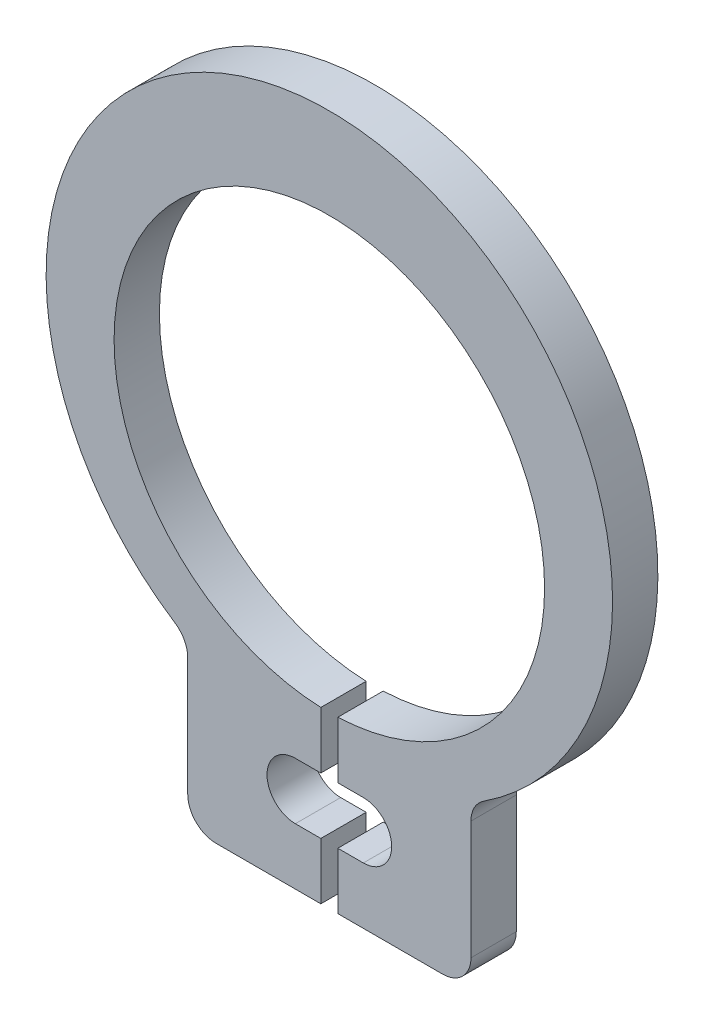
ISO-10303-21;
HEADER;
FILE_DESCRIPTION(('STEP AP214'),'2;1');
FILE_NAME('part.step','',(''),(''),'','','');
FILE_SCHEMA(('AUTOMOTIVE_DESIGN { 1 0 10303 214 1 1 1 1 }'));
ENDSEC;
DATA;
#1=APPLICATION_CONTEXT('core data for automotive mechanical design processes');
#2=APPLICATION_PROTOCOL_DEFINITION('international standard','automotive_design',2000,#1);
#3=PRODUCT_CONTEXT('',#1,'mechanical');
#4=PRODUCT('Part','Part','',(#3));
#5=PRODUCT_RELATED_PRODUCT_CATEGORY('part','',(#4));
#6=PRODUCT_DEFINITION_FORMATION('','',#4);
#7=PRODUCT_DEFINITION_CONTEXT('part definition',#1,'design');
#8=PRODUCT_DEFINITION('design','',#6,#7);
#9=PRODUCT_DEFINITION_SHAPE('','',#8);
#10=(LENGTH_UNIT() NAMED_UNIT(*) SI_UNIT(.MILLI.,.METRE.));
#11=(NAMED_UNIT(*) PLANE_ANGLE_UNIT() SI_UNIT($,.RADIAN.));
#12=(NAMED_UNIT(*) SI_UNIT($,.STERADIAN.) SOLID_ANGLE_UNIT());
#13=UNCERTAINTY_MEASURE_WITH_UNIT(LENGTH_MEASURE(1.E-05),#10,'distance_accuracy_value','');
#14=(GEOMETRIC_REPRESENTATION_CONTEXT(3) GLOBAL_UNCERTAINTY_ASSIGNED_CONTEXT((#13)) GLOBAL_UNIT_ASSIGNED_CONTEXT((#10,
#11,#12)) REPRESENTATION_CONTEXT('',''));
#15=CARTESIAN_POINT('',(0.,0.,0.));
#16=DIRECTION('',(0.,0.,1.));
#17=DIRECTION('',(1.,0.,0.));
#18=AXIS2_PLACEMENT_3D('',#15,#16,#17);
#19=CARTESIAN_POINT('',(-0.15,-6.8,0.8));
#20=DIRECTION('',(-1.,0.,0.));
#21=DIRECTION('',(0.,-1.,0.));
#22=AXIS2_PLACEMENT_3D('',#19,#20,#21);
#23=PLANE('',#22);
#24=DIRECTION('',(0.,1.,0.));
#25=VECTOR('',#24,1.);
#26=CARTESIAN_POINT('',(-0.15,-6.8,0.8));
#27=LINE('',#26,#25);
#28=CARTESIAN_POINT('',(-0.15,-4.8,0.8));
#29=VERTEX_POINT('',#28);
#30=CARTESIAN_POINT('',(-0.15,-3.79703831953274,0.8));
#31=VERTEX_POINT('',#30);
#32=EDGE_CURVE('E239',#29,#31,#27,.T.);
#33=ORIENTED_EDGE('',*,*,#32,.F.);
#34=DIRECTION('',(0.,0.,-1.));
#35=VECTOR('',#34,1.);
#36=CARTESIAN_POINT('',(-0.15,-4.8,0.8));
#37=LINE('',#36,#35);
#38=CARTESIAN_POINT('',(-0.15,-4.8,0.));
#39=VERTEX_POINT('',#38);
#40=EDGE_CURVE('E221',#29,#39,#37,.T.);
#41=ORIENTED_EDGE('',*,*,#40,.T.);
#42=DIRECTION('',(0.,1.,0.));
#43=VECTOR('',#42,1.);
#44=CARTESIAN_POINT('',(-0.15,-6.8,0.));
#45=LINE('',#44,#43);
#46=CARTESIAN_POINT('',(-0.15,-3.79703831953274,0.));
#47=VERTEX_POINT('',#46);
#48=EDGE_CURVE('E267',#39,#47,#45,.T.);
#49=ORIENTED_EDGE('',*,*,#48,.T.);
#50=DIRECTION('',(0.,0.,-1.));
#51=VECTOR('',#50,1.);
#52=CARTESIAN_POINT('',(-0.15,-3.79703831953274,0.8));
#53=LINE('',#52,#51);
#54=EDGE_CURVE('E296',#31,#47,#53,.T.);
#55=ORIENTED_EDGE('',*,*,#54,.F.);
#56=EDGE_LOOP('',(#33,#41,#49,#55));
#57=FACE_BOUND('',#56,.T.);
#58=ADVANCED_FACE('F36',(#57),#23,.F.);
#59=CARTESIAN_POINT('',(0.15,-3.79703831953274,0.8));
#60=DIRECTION('',(1.,0.,0.));
#61=DIRECTION('',(0.,1.,0.));
#62=AXIS2_PLACEMENT_3D('',#59,#60,#61);
#63=PLANE('',#62);
#64=DIRECTION('',(0.,-1.,0.));
#65=VECTOR('',#64,1.);
#66=CARTESIAN_POINT('',(0.15,-3.79703831953274,0.));
#67=LINE('',#66,#65);
#68=CARTESIAN_POINT('',(0.150000000000005,-3.79703831953274,0.));
#69=VERTEX_POINT('',#68);
#70=CARTESIAN_POINT('',(0.150000000000003,-4.8,0.));
#71=VERTEX_POINT('',#70);
#72=EDGE_CURVE('E274',#69,#71,#67,.T.);
#73=ORIENTED_EDGE('',*,*,#72,.T.);
#74=DIRECTION('',(0.,0.,1.));
#75=VECTOR('',#74,1.);
#76=CARTESIAN_POINT('',(0.15,-4.8,0.8));
#77=LINE('',#76,#75);
#78=CARTESIAN_POINT('',(0.150000000000003,-4.8,0.8));
#79=VERTEX_POINT('',#78);
#80=EDGE_CURVE('E218',#71,#79,#77,.T.);
#81=ORIENTED_EDGE('',*,*,#80,.T.);
#82=DIRECTION('',(0.,-1.,0.));
#83=VECTOR('',#82,1.);
#84=CARTESIAN_POINT('',(0.15,-3.79703831953274,0.8));
#85=LINE('',#84,#83);
#86=CARTESIAN_POINT('',(0.150000000000005,-3.79703831953274,0.8));
#87=VERTEX_POINT('',#86);
#88=EDGE_CURVE('E246',#87,#79,#85,.T.);
#89=ORIENTED_EDGE('',*,*,#88,.F.);
#90=DIRECTION('',(0.,0.,-1.));
#91=VECTOR('',#90,1.);
#92=CARTESIAN_POINT('',(0.150000000000005,-3.79703831953274,0.8));
#93=LINE('',#92,#91);
#94=EDGE_CURVE('E293',#87,#69,#93,.T.);
#95=ORIENTED_EDGE('',*,*,#94,.T.);
#96=EDGE_LOOP('',(#73,#81,#89,#95));
#97=FACE_BOUND('',#96,.T.);
#98=ADVANCED_FACE('F388',(#97),#63,.F.);
#99=CARTESIAN_POINT('',(3.,-4.20977222864644,0.8));
#100=DIRECTION('',(0.,0.,-1.));
#101=DIRECTION('',(-1.,0.,0.));
#102=AXIS2_PLACEMENT_3D('',#99,#100,#101);
#103=CYLINDRICAL_SURFACE('',#102,0.499999999999999);
#104=CARTESIAN_POINT('',(3.,-4.20977222864644,0.));
#105=DIRECTION('',(0.,0.,-1.));
#106=DIRECTION('',(-1.,0.,0.));
#107=AXIS2_PLACEMENT_3D('',#104,#105,#106);
#108=CIRCLE('',#107,0.499999999999999);
#109=CARTESIAN_POINT('',(2.5,-4.20977222864644,0.));
#110=VERTEX_POINT('',#109);
#111=CARTESIAN_POINT('',(2.72727272727273,-3.79070202604222,0.));
#112=VERTEX_POINT('',#111);
#113=EDGE_CURVE('E224',#110,#112,#108,.T.);
#114=ORIENTED_EDGE('',*,*,#113,.T.);
#115=DIRECTION('',(0.,0.,-1.));
#116=VECTOR('',#115,1.);
#117=CARTESIAN_POINT('',(2.72727272727273,-3.79070202604222,0.8));
#118=LINE('',#117,#116);
#119=CARTESIAN_POINT('',(2.72727272727273,-3.79070202604222,0.8));
#120=VERTEX_POINT('',#119);
#121=EDGE_CURVE('E314',#120,#112,#118,.T.);
#122=ORIENTED_EDGE('',*,*,#121,.F.);
#123=CARTESIAN_POINT('',(3.,-4.20977222864644,0.8));
#124=DIRECTION('',(0.,0.,-1.));
#125=DIRECTION('',(-1.,0.,0.));
#126=AXIS2_PLACEMENT_3D('',#123,#124,#125);
#127=CIRCLE('',#126,0.499999999999999);
#128=CARTESIAN_POINT('',(2.5,-4.20977222864644,0.8));
#129=VERTEX_POINT('',#128);
#130=EDGE_CURVE('E225',#129,#120,#127,.T.);
#131=ORIENTED_EDGE('',*,*,#130,.F.);
#132=DIRECTION('',(0.,0.,-1.));
#133=VECTOR('',#132,1.);
#134=CARTESIAN_POINT('',(2.5,-4.20977222864644,0.8));
#135=LINE('',#134,#133);
#136=EDGE_CURVE('E254',#129,#110,#135,.T.);
#137=ORIENTED_EDGE('',*,*,#136,.T.);
#138=EDGE_LOOP('',(#114,#122,#131,#137));
#139=FACE_BOUND('',#138,.T.);
#140=ADVANCED_FACE('F38',(#139),#103,.F.);
#141=CARTESIAN_POINT('',(0.,0.4,0.8));
#142=DIRECTION('',(0.,0.,-1.));
#143=DIRECTION('',(-1.,0.,0.));
#144=AXIS2_PLACEMENT_3D('',#141,#142,#143);
#145=CYLINDRICAL_SURFACE('',#144,5.);
#146=CARTESIAN_POINT('',(0.,0.4,0.));
#147=DIRECTION('',(0.,0.,1.));
#148=DIRECTION('',(1.,0.,0.));
#149=AXIS2_PLACEMENT_3D('',#146,#147,#148);
#150=CIRCLE('',#149,5.);
#151=CARTESIAN_POINT('',(-2.72727272727273,-3.79070202604222,0.));
#152=VERTEX_POINT('',#151);
#153=EDGE_CURVE('E257',#112,#152,#150,.T.);
#154=ORIENTED_EDGE('',*,*,#153,.T.);
#155=DIRECTION('',(0.,0.,-1.));
#156=VECTOR('',#155,1.);
#157=CARTESIAN_POINT('',(-2.72727272727273,-3.79070202604222,0.8));
#158=LINE('',#157,#156);
#159=CARTESIAN_POINT('',(-2.72727272727273,-3.79070202604222,0.8));
#160=VERTEX_POINT('',#159);
#161=EDGE_CURVE('E311',#160,#152,#158,.T.);
#162=ORIENTED_EDGE('',*,*,#161,.F.);
#163=CARTESIAN_POINT('',(0.,0.4,0.8));
#164=DIRECTION('',(0.,0.,1.));
#165=DIRECTION('',(1.,0.,0.));
#166=AXIS2_PLACEMENT_3D('',#163,#164,#165);
#167=CIRCLE('',#166,5.);
#168=EDGE_CURVE('E228',#120,#160,#167,.T.);
#169=ORIENTED_EDGE('',*,*,#168,.F.);
#170=ORIENTED_EDGE('',*,*,#121,.T.);
#171=EDGE_LOOP('',(#154,#162,#169,#170));
#172=FACE_BOUND('',#171,.T.);
#173=ADVANCED_FACE('F362',(#172),#145,.T.);
#174=CARTESIAN_POINT('',(-3.,-4.20977222864644,0.8));
#175=DIRECTION('',(0.,0.,-1.));
#176=DIRECTION('',(-1.,0.,0.));
#177=AXIS2_PLACEMENT_3D('',#174,#175,#176);
#178=CYLINDRICAL_SURFACE('',#177,0.5);
#179=CARTESIAN_POINT('',(-3.,-4.20977222864644,0.));
#180=DIRECTION('',(0.,0.,-1.));
#181=DIRECTION('',(-1.,0.,0.));
#182=AXIS2_PLACEMENT_3D('',#179,#180,#181);
#183=CIRCLE('',#182,0.5);
#184=CARTESIAN_POINT('',(-2.5,-4.20977222864644,0.));
#185=VERTEX_POINT('',#184);
#186=EDGE_CURVE('E259',#152,#185,#183,.T.);
#187=ORIENTED_EDGE('',*,*,#186,.T.);
#188=DIRECTION('',(0.,0.,-1.));
#189=VECTOR('',#188,1.);
#190=CARTESIAN_POINT('',(-2.5,-4.20977222864644,0.8));
#191=LINE('',#190,#189);
#192=CARTESIAN_POINT('',(-2.5,-4.20977222864644,0.8));
#193=VERTEX_POINT('',#192);
#194=EDGE_CURVE('E308',#193,#185,#191,.T.);
#195=ORIENTED_EDGE('',*,*,#194,.F.);
#196=CARTESIAN_POINT('',(-3.,-4.20977222864644,0.8));
#197=DIRECTION('',(0.,0.,-1.));
#198=DIRECTION('',(-1.,0.,0.));
#199=AXIS2_PLACEMENT_3D('',#196,#197,#198);
#200=CIRCLE('',#199,0.5);
#201=EDGE_CURVE('E231',#160,#193,#200,.T.);
#202=ORIENTED_EDGE('',*,*,#201,.F.);
#203=ORIENTED_EDGE('',*,*,#161,.T.);
#204=EDGE_LOOP('',(#187,#195,#202,#203));
#205=FACE_BOUND('',#204,.T.);
#206=ADVANCED_FACE('F358',(#205),#178,.F.);
#207=CARTESIAN_POINT('',(-2.5,-4.20977222864644,0.8));
#208=DIRECTION('',(1.,0.,0.));
#209=DIRECTION('',(0.,1.,0.));
#210=AXIS2_PLACEMENT_3D('',#207,#208,#209);
#211=PLANE('',#210);
#212=DIRECTION('',(0.,-1.,0.));
#213=VECTOR('',#212,1.);
#214=CARTESIAN_POINT('',(-2.5,-4.20977222864644,0.));
#215=LINE('',#214,#213);
#216=CARTESIAN_POINT('',(-2.5,-6.3,0.));
#217=VERTEX_POINT('',#216);
#218=EDGE_CURVE('E261',#185,#217,#215,.T.);
#219=ORIENTED_EDGE('',*,*,#218,.T.);
#220=DIRECTION('',(0.,0.,-1.));
#221=VECTOR('',#220,1.);
#222=CARTESIAN_POINT('',(-2.5,-6.3,0.8));
#223=LINE('',#222,#221);
#224=CARTESIAN_POINT('',(-2.5,-6.3,0.8));
#225=VERTEX_POINT('',#224);
#226=EDGE_CURVE('E305',#225,#217,#223,.T.);
#227=ORIENTED_EDGE('',*,*,#226,.F.);
#228=DIRECTION('',(0.,-1.,0.));
#229=VECTOR('',#228,1.);
#230=CARTESIAN_POINT('',(-2.5,-4.20977222864644,0.8));
#231=LINE('',#230,#229);
#232=EDGE_CURVE('E233',#193,#225,#231,.T.);
#233=ORIENTED_EDGE('',*,*,#232,.F.);
#234=ORIENTED_EDGE('',*,*,#194,.T.);
#235=EDGE_LOOP('',(#219,#227,#233,#234));
#236=FACE_BOUND('',#235,.T.);
#237=ADVANCED_FACE('F353',(#236),#211,.F.);
#238=CARTESIAN_POINT('',(-2.,-6.3,0.8));
#239=DIRECTION('',(0.,0.,-1.));
#240=DIRECTION('',(-1.,0.,0.));
#241=AXIS2_PLACEMENT_3D('',#238,#239,#240);
#242=CYLINDRICAL_SURFACE('',#241,0.5);
#243=CARTESIAN_POINT('',(-2.,-6.3,0.));
#244=DIRECTION('',(0.,0.,1.));
#245=DIRECTION('',(1.,0.,0.));
#246=AXIS2_PLACEMENT_3D('',#243,#244,#245);
#247=CIRCLE('',#246,0.5);
#248=CARTESIAN_POINT('',(-2.,-6.8,0.));
#249=VERTEX_POINT('',#248);
#250=EDGE_CURVE('E263',#217,#249,#247,.T.);
#251=ORIENTED_EDGE('',*,*,#250,.T.);
#252=DIRECTION('',(0.,0.,-1.));
#253=VECTOR('',#252,1.);
#254=CARTESIAN_POINT('',(-2.,-6.8,0.8));
#255=LINE('',#254,#253);
#256=CARTESIAN_POINT('',(-2.,-6.8,0.8));
#257=VERTEX_POINT('',#256);
#258=EDGE_CURVE('E302',#257,#249,#255,.T.);
#259=ORIENTED_EDGE('',*,*,#258,.F.);
#260=CARTESIAN_POINT('',(-2.,-6.3,0.8));
#261=DIRECTION('',(0.,0.,1.));
#262=DIRECTION('',(1.,0.,0.));
#263=AXIS2_PLACEMENT_3D('',#260,#261,#262);
#264=CIRCLE('',#263,0.5);
#265=EDGE_CURVE('E235',#225,#257,#264,.T.);
#266=ORIENTED_EDGE('',*,*,#265,.F.);
#267=ORIENTED_EDGE('',*,*,#226,.T.);
#268=EDGE_LOOP('',(#251,#259,#266,#267));
#269=FACE_BOUND('',#268,.T.);
#270=ADVANCED_FACE('F349',(#269),#242,.T.);
#271=CARTESIAN_POINT('',(-2.,-6.8,0.8));
#272=DIRECTION('',(0.,1.,0.));
#273=DIRECTION('',(0.,0.,1.));
#274=AXIS2_PLACEMENT_3D('',#271,#272,#273);
#275=PLANE('',#274);
#276=DIRECTION('',(1.,0.,0.));
#277=VECTOR('',#276,1.);
#278=CARTESIAN_POINT('',(-2.,-6.8,0.));
#279=LINE('',#278,#277);
#280=CARTESIAN_POINT('',(-0.15,-6.8,0.));
#281=VERTEX_POINT('',#280);
#282=EDGE_CURVE('E265',#249,#281,#279,.T.);
#283=ORIENTED_EDGE('',*,*,#282,.T.);
#284=DIRECTION('',(0.,0.,-1.));
#285=VECTOR('',#284,1.);
#286=CARTESIAN_POINT('',(-0.15,-6.8,0.8));
#287=LINE('',#286,#285);
#288=CARTESIAN_POINT('',(-0.15,-6.8,0.8));
#289=VERTEX_POINT('',#288);
#290=EDGE_CURVE('E299',#289,#281,#287,.T.);
#291=ORIENTED_EDGE('',*,*,#290,.F.);
#292=DIRECTION('',(1.,0.,0.));
#293=VECTOR('',#292,1.);
#294=CARTESIAN_POINT('',(-2.,-6.8,0.8));
#295=LINE('',#294,#293);
#296=EDGE_CURVE('E237',#257,#289,#295,.T.);
#297=ORIENTED_EDGE('',*,*,#296,.F.);
#298=ORIENTED_EDGE('',*,*,#258,.T.);
#299=EDGE_LOOP('',(#283,#291,#297,#298));
#300=FACE_BOUND('',#299,.T.);
#301=ADVANCED_FACE('F344',(#300),#275,.F.);
#302=CARTESIAN_POINT('',(-0.15,-5.8,0.));
#303=VERTEX_POINT('',#302);
#304=EDGE_CURVE('E268',#281,#303,#45,.T.);
#305=ORIENTED_EDGE('',*,*,#304,.T.);
#306=DIRECTION('',(0.,0.,1.));
#307=VECTOR('',#306,1.);
#308=CARTESIAN_POINT('',(-0.15,-5.8,0.8));
#309=LINE('',#308,#307);
#310=CARTESIAN_POINT('',(-0.15,-5.8,0.8));
#311=VERTEX_POINT('',#310);
#312=EDGE_CURVE('E59',#303,#311,#309,.T.);
#313=ORIENTED_EDGE('',*,*,#312,.T.);
#314=EDGE_CURVE('E240',#289,#311,#27,.T.);
#315=ORIENTED_EDGE('',*,*,#314,.F.);
#316=ORIENTED_EDGE('',*,*,#290,.T.);
#317=EDGE_LOOP('',(#305,#313,#315,#316));
#318=FACE_BOUND('',#317,.T.);
#319=ADVANCED_FACE('F338',(#318),#23,.F.);
#320=CARTESIAN_POINT('',(0.,0.,0.8));
#321=DIRECTION('',(0.,0.,-1.));
#322=DIRECTION('',(-1.,0.,0.));
#323=AXIS2_PLACEMENT_3D('',#320,#321,#322);
#324=CYLINDRICAL_SURFACE('',#323,3.80000000000002);
#325=CARTESIAN_POINT('',(0.,0.,0.));
#326=DIRECTION('',(0.,0.,-1.));
#327=DIRECTION('',(-1.,0.,0.));
#328=AXIS2_PLACEMENT_3D('',#325,#326,#327);
#329=CIRCLE('',#328,3.80000000000002);
#330=EDGE_CURVE('E271',#47,#69,#329,.T.);
#331=ORIENTED_EDGE('',*,*,#330,.T.);
#332=ORIENTED_EDGE('',*,*,#94,.F.);
#333=CARTESIAN_POINT('',(0.,0.,0.8));
#334=DIRECTION('',(0.,0.,-1.));
#335=DIRECTION('',(-1.,0.,0.));
#336=AXIS2_PLACEMENT_3D('',#333,#334,#335);
#337=CIRCLE('',#336,3.80000000000002);
#338=EDGE_CURVE('E243',#31,#87,#337,.T.);
#339=ORIENTED_EDGE('',*,*,#338,.F.);
#340=ORIENTED_EDGE('',*,*,#54,.T.);
#341=EDGE_LOOP('',(#331,#332,#339,#340));
#342=FACE_BOUND('',#341,.T.);
#343=ADVANCED_FACE('F386',(#342),#324,.F.);
#344=CARTESIAN_POINT('',(0.150000000000003,-5.8,0.8));
#345=VERTEX_POINT('',#344);
#346=CARTESIAN_POINT('',(0.15,-6.8,0.8));
#347=VERTEX_POINT('',#346);
#348=EDGE_CURVE('E245',#345,#347,#85,.T.);
#349=ORIENTED_EDGE('',*,*,#348,.F.);
#350=DIRECTION('',(0.,0.,-1.));
#351=VECTOR('',#350,1.);
#352=CARTESIAN_POINT('',(0.15,-5.8,0.8));
#353=LINE('',#352,#351);
#354=CARTESIAN_POINT('',(0.150000000000003,-5.8,0.));
#355=VERTEX_POINT('',#354);
#356=EDGE_CURVE('E186',#345,#355,#353,.T.);
#357=ORIENTED_EDGE('',*,*,#356,.T.);
#358=CARTESIAN_POINT('',(0.15,-6.8,0.));
#359=VERTEX_POINT('',#358);
#360=EDGE_CURVE('E273',#355,#359,#67,.T.);
#361=ORIENTED_EDGE('',*,*,#360,.T.);
#362=DIRECTION('',(0.,0.,-1.));
#363=VECTOR('',#362,1.);
#364=CARTESIAN_POINT('',(0.15,-6.8,0.8));
#365=LINE('',#364,#363);
#366=EDGE_CURVE('E290',#347,#359,#365,.T.);
#367=ORIENTED_EDGE('',*,*,#366,.F.);
#368=EDGE_LOOP('',(#349,#357,#361,#367));
#369=FACE_BOUND('',#368,.T.);
#370=ADVANCED_FACE('F384',(#369),#63,.F.);
#371=CARTESIAN_POINT('',(0.15,-6.8,0.8));
#372=DIRECTION('',(0.,1.,0.));
#373=DIRECTION('',(0.,0.,1.));
#374=AXIS2_PLACEMENT_3D('',#371,#372,#373);
#375=PLANE('',#374);
#376=DIRECTION('',(1.,0.,0.));
#377=VECTOR('',#376,1.);
#378=CARTESIAN_POINT('',(0.15,-6.8,0.));
#379=LINE('',#378,#377);
#380=CARTESIAN_POINT('',(2.,-6.8,0.));
#381=VERTEX_POINT('',#380);
#382=EDGE_CURVE('E277',#359,#381,#379,.T.);
#383=ORIENTED_EDGE('',*,*,#382,.T.);
#384=DIRECTION('',(0.,0.,-1.));
#385=VECTOR('',#384,1.);
#386=CARTESIAN_POINT('',(2.,-6.8,0.8));
#387=LINE('',#386,#385);
#388=CARTESIAN_POINT('',(2.,-6.8,0.8));
#389=VERTEX_POINT('',#388);
#390=EDGE_CURVE('E287',#389,#381,#387,.T.);
#391=ORIENTED_EDGE('',*,*,#390,.F.);
#392=DIRECTION('',(1.,0.,0.));
#393=VECTOR('',#392,1.);
#394=CARTESIAN_POINT('',(0.15,-6.8,0.8));
#395=LINE('',#394,#393);
#396=EDGE_CURVE('E248',#347,#389,#395,.T.);
#397=ORIENTED_EDGE('',*,*,#396,.F.);
#398=ORIENTED_EDGE('',*,*,#366,.T.);
#399=EDGE_LOOP('',(#383,#391,#397,#398));
#400=FACE_BOUND('',#399,.T.);
#401=ADVANCED_FACE('F380',(#400),#375,.F.);
#402=CARTESIAN_POINT('',(2.,-6.3,0.8));
#403=DIRECTION('',(0.,0.,-1.));
#404=DIRECTION('',(-1.,0.,0.));
#405=AXIS2_PLACEMENT_3D('',#402,#403,#404);
#406=CYLINDRICAL_SURFACE('',#405,0.5);
#407=CARTESIAN_POINT('',(2.,-6.3,0.));
#408=DIRECTION('',(0.,0.,1.));
#409=DIRECTION('',(1.,0.,0.));
#410=AXIS2_PLACEMENT_3D('',#407,#408,#409);
#411=CIRCLE('',#410,0.5);
#412=CARTESIAN_POINT('',(2.5,-6.3,0.));
#413=VERTEX_POINT('',#412);
#414=EDGE_CURVE('E279',#381,#413,#411,.T.);
#415=ORIENTED_EDGE('',*,*,#414,.T.);
#416=DIRECTION('',(0.,0.,-1.));
#417=VECTOR('',#416,1.);
#418=CARTESIAN_POINT('',(2.5,-6.3,0.8));
#419=LINE('',#418,#417);
#420=CARTESIAN_POINT('',(2.5,-6.3,0.8));
#421=VERTEX_POINT('',#420);
#422=EDGE_CURVE('E284',#421,#413,#419,.T.);
#423=ORIENTED_EDGE('',*,*,#422,.F.);
#424=CARTESIAN_POINT('',(2.,-6.3,0.8));
#425=DIRECTION('',(0.,0.,1.));
#426=DIRECTION('',(1.,0.,0.));
#427=AXIS2_PLACEMENT_3D('',#424,#425,#426);
#428=CIRCLE('',#427,0.5);
#429=EDGE_CURVE('E250',#389,#421,#428,.T.);
#430=ORIENTED_EDGE('',*,*,#429,.F.);
#431=ORIENTED_EDGE('',*,*,#390,.T.);
#432=EDGE_LOOP('',(#415,#423,#430,#431));
#433=FACE_BOUND('',#432,.T.);
#434=ADVANCED_FACE('F376',(#433),#406,.T.);
#435=CARTESIAN_POINT('',(2.5,-6.3,0.8));
#436=DIRECTION('',(-1.,0.,0.));
#437=DIRECTION('',(0.,-1.,0.));
#438=AXIS2_PLACEMENT_3D('',#435,#436,#437);
#439=PLANE('',#438);
#440=DIRECTION('',(0.,1.,0.));
#441=VECTOR('',#440,1.);
#442=CARTESIAN_POINT('',(2.5,-6.3,0.));
#443=LINE('',#442,#441);
#444=EDGE_CURVE('E229',#413,#110,#443,.T.);
#445=ORIENTED_EDGE('',*,*,#444,.T.);
#446=ORIENTED_EDGE('',*,*,#136,.F.);
#447=DIRECTION('',(0.,1.,0.));
#448=VECTOR('',#447,1.);
#449=CARTESIAN_POINT('',(2.5,-6.3,0.8));
#450=LINE('',#449,#448);
#451=EDGE_CURVE('E252',#421,#129,#450,.T.);
#452=ORIENTED_EDGE('',*,*,#451,.F.);
#453=ORIENTED_EDGE('',*,*,#422,.T.);
#454=EDGE_LOOP('',(#445,#446,#452,#453));
#455=FACE_BOUND('',#454,.T.);
#456=ADVANCED_FACE('F371',(#455),#439,.F.);
#457=CARTESIAN_POINT('',(3.,-4.20977222864644,0.8));
#458=DIRECTION('',(0.,0.,-1.));
#459=DIRECTION('',(-1.,0.,0.));
#460=AXIS2_PLACEMENT_3D('',#457,#458,#459);
#461=PLANE('',#460);
#462=ORIENTED_EDGE('',*,*,#88,.T.);
#463=DIRECTION('',(1.,0.,0.));
#464=VECTOR('',#463,1.);
#465=CARTESIAN_POINT('',(0.599999999999999,-4.8,0.8));
#466=LINE('',#465,#464);
#467=CARTESIAN_POINT('',(0.599999999999999,-4.8,0.8));
#468=VERTEX_POINT('',#467);
#469=EDGE_CURVE('E194',#79,#468,#466,.T.);
#470=ORIENTED_EDGE('',*,*,#469,.T.);
#471=CARTESIAN_POINT('',(0.599999999999999,-5.3,0.8));
#472=DIRECTION('',(0.,0.,-1.));
#473=DIRECTION('',(-1.,0.,0.));
#474=AXIS2_PLACEMENT_3D('',#471,#472,#473);
#475=CIRCLE('',#474,0.5);
#476=CARTESIAN_POINT('',(0.599999999999999,-5.8,0.8));
#477=VERTEX_POINT('',#476);
#478=EDGE_CURVE('E175',#468,#477,#475,.T.);
#479=ORIENTED_EDGE('',*,*,#478,.T.);
#480=DIRECTION('',(-1.,0.,0.));
#481=VECTOR('',#480,1.);
#482=CARTESIAN_POINT('',(-0.600000000000001,-5.8,0.8));
#483=LINE('',#482,#481);
#484=EDGE_CURVE('E183',#477,#345,#483,.T.);
#485=ORIENTED_EDGE('',*,*,#484,.T.);
#486=ORIENTED_EDGE('',*,*,#348,.T.);
#487=ORIENTED_EDGE('',*,*,#396,.T.);
#488=ORIENTED_EDGE('',*,*,#429,.T.);
#489=ORIENTED_EDGE('',*,*,#451,.T.);
#490=ORIENTED_EDGE('',*,*,#130,.T.);
#491=ORIENTED_EDGE('',*,*,#168,.T.);
#492=ORIENTED_EDGE('',*,*,#201,.T.);
#493=ORIENTED_EDGE('',*,*,#232,.T.);
#494=ORIENTED_EDGE('',*,*,#265,.T.);
#495=ORIENTED_EDGE('',*,*,#296,.T.);
#496=ORIENTED_EDGE('',*,*,#314,.T.);
#497=CARTESIAN_POINT('',(-0.600000000000001,-5.8,0.8));
#498=VERTEX_POINT('',#497);
#499=EDGE_CURVE('E190',#311,#498,#483,.T.);
#500=ORIENTED_EDGE('',*,*,#499,.T.);
#501=CARTESIAN_POINT('',(-0.600000000000001,-5.3,0.8));
#502=DIRECTION('',(0.,0.,-1.));
#503=DIRECTION('',(-1.,0.,0.));
#504=AXIS2_PLACEMENT_3D('',#501,#502,#503);
#505=CIRCLE('',#504,0.5);
#506=CARTESIAN_POINT('',(-0.600000000000001,-4.8,0.8));
#507=VERTEX_POINT('',#506);
#508=EDGE_CURVE('E189',#498,#507,#505,.T.);
#509=ORIENTED_EDGE('',*,*,#508,.T.);
#510=EDGE_CURVE('E180',#507,#29,#466,.T.);
#511=ORIENTED_EDGE('',*,*,#510,.T.);
#512=ORIENTED_EDGE('',*,*,#32,.T.);
#513=ORIENTED_EDGE('',*,*,#338,.T.);
#514=EDGE_LOOP('',(#462,#470,#479,#485,#486,#487,#488,#489,#490,#491,#492,#493,#494,#495,#496,
#500,#509,#511,#512,#513));
#515=FACE_BOUND('',#514,.T.);
#516=ADVANCED_FACE('F193',(#515),#461,.F.);
#517=CARTESIAN_POINT('',(3.,-4.20977222864644,0.));
#518=DIRECTION('',(0.,0.,-1.));
#519=DIRECTION('',(-1.,0.,0.));
#520=AXIS2_PLACEMENT_3D('',#517,#518,#519);
#521=PLANE('',#520);
#522=DIRECTION('',(1.,0.,0.));
#523=VECTOR('',#522,1.);
#524=CARTESIAN_POINT('',(3.,-4.8,0.));
#525=LINE('',#524,#523);
#526=CARTESIAN_POINT('',(0.599999999999999,-4.8,0.));
#527=VERTEX_POINT('',#526);
#528=EDGE_CURVE('E11',#71,#527,#525,.T.);
#529=ORIENTED_EDGE('',*,*,#528,.F.);
#530=ORIENTED_EDGE('',*,*,#72,.F.);
#531=ORIENTED_EDGE('',*,*,#330,.F.);
#532=ORIENTED_EDGE('',*,*,#48,.F.);
#533=DIRECTION('',(1.,0.,0.));
#534=VECTOR('',#533,1.);
#535=CARTESIAN_POINT('',(0.599999999999999,-4.8,0.));
#536=LINE('',#535,#534);
#537=CARTESIAN_POINT('',(-0.600000000000001,-4.8,0.));
#538=VERTEX_POINT('',#537);
#539=EDGE_CURVE('E195',#538,#39,#536,.T.);
#540=ORIENTED_EDGE('',*,*,#539,.F.);
#541=CARTESIAN_POINT('',(-0.600000000000001,-5.3,0.));
#542=DIRECTION('',(0.,0.,-1.));
#543=DIRECTION('',(-1.,0.,0.));
#544=AXIS2_PLACEMENT_3D('',#541,#542,#543);
#545=CIRCLE('',#544,0.5);
#546=CARTESIAN_POINT('',(-0.600000000000001,-5.8,0.));
#547=VERTEX_POINT('',#546);
#548=EDGE_CURVE('E198',#547,#538,#545,.T.);
#549=ORIENTED_EDGE('',*,*,#548,.F.);
#550=DIRECTION('',(-1.,0.,0.));
#551=VECTOR('',#550,1.);
#552=CARTESIAN_POINT('',(3.,-5.8,0.));
#553=LINE('',#552,#551);
#554=EDGE_CURVE('E44',#303,#547,#553,.T.);
#555=ORIENTED_EDGE('',*,*,#554,.F.);
#556=ORIENTED_EDGE('',*,*,#304,.F.);
#557=ORIENTED_EDGE('',*,*,#282,.F.);
#558=ORIENTED_EDGE('',*,*,#250,.F.);
#559=ORIENTED_EDGE('',*,*,#218,.F.);
#560=ORIENTED_EDGE('',*,*,#186,.F.);
#561=ORIENTED_EDGE('',*,*,#153,.F.);
#562=ORIENTED_EDGE('',*,*,#113,.F.);
#563=ORIENTED_EDGE('',*,*,#444,.F.);
#564=ORIENTED_EDGE('',*,*,#414,.F.);
#565=ORIENTED_EDGE('',*,*,#382,.F.);
#566=ORIENTED_EDGE('',*,*,#360,.F.);
#567=DIRECTION('',(-1.,0.,0.));
#568=VECTOR('',#567,1.);
#569=CARTESIAN_POINT('',(-0.600000000000001,-5.8,0.));
#570=LINE('',#569,#568);
#571=CARTESIAN_POINT('',(0.599999999999999,-5.8,0.));
#572=VERTEX_POINT('',#571);
#573=EDGE_CURVE('E206',#572,#355,#570,.T.);
#574=ORIENTED_EDGE('',*,*,#573,.F.);
#575=CARTESIAN_POINT('',(0.599999999999999,-5.3,0.));
#576=DIRECTION('',(0.,0.,-1.));
#577=DIRECTION('',(-1.,0.,0.));
#578=AXIS2_PLACEMENT_3D('',#575,#576,#577);
#579=CIRCLE('',#578,0.5);
#580=EDGE_CURVE('E51',#527,#572,#579,.T.);
#581=ORIENTED_EDGE('',*,*,#580,.F.);
#582=EDGE_LOOP('',(#529,#530,#531,#532,#540,#549,#555,#556,#557,#558,#559,#560,#561,#562,#563,
#564,#565,#566,#574,#581));
#583=FACE_BOUND('',#582,.T.);
#584=ADVANCED_FACE('F325',(#583),#521,.T.);
#585=CARTESIAN_POINT('',(-0.600000000000001,-5.8,0.8));
#586=DIRECTION('',(0.,-1.,0.));
#587=DIRECTION('',(0.,0.,-1.));
#588=AXIS2_PLACEMENT_3D('',#585,#586,#587);
#589=PLANE('',#588);
#590=ORIENTED_EDGE('',*,*,#554,.T.);
#591=DIRECTION('',(0.,0.,-1.));
#592=VECTOR('',#591,1.);
#593=CARTESIAN_POINT('',(-0.600000000000001,-5.8,0.8));
#594=LINE('',#593,#592);
#595=EDGE_CURVE('E179',#498,#547,#594,.T.);
#596=ORIENTED_EDGE('',*,*,#595,.F.);
#597=ORIENTED_EDGE('',*,*,#499,.F.);
#598=ORIENTED_EDGE('',*,*,#312,.F.);
#599=EDGE_LOOP('',(#590,#596,#597,#598));
#600=FACE_BOUND('',#599,.T.);
#601=ADVANCED_FACE('F316',(#600),#589,.F.);
#602=CARTESIAN_POINT('',(-0.600000000000001,-5.3,0.8));
#603=DIRECTION('',(0.,0.,-1.));
#604=DIRECTION('',(-1.,0.,0.));
#605=AXIS2_PLACEMENT_3D('',#602,#603,#604);
#606=CYLINDRICAL_SURFACE('',#605,0.5);
#607=ORIENTED_EDGE('',*,*,#548,.T.);
#608=DIRECTION('',(0.,0.,-1.));
#609=VECTOR('',#608,1.);
#610=CARTESIAN_POINT('',(-0.600000000000001,-4.8,0.8));
#611=LINE('',#610,#609);
#612=EDGE_CURVE('E212',#507,#538,#611,.T.);
#613=ORIENTED_EDGE('',*,*,#612,.F.);
#614=ORIENTED_EDGE('',*,*,#508,.F.);
#615=ORIENTED_EDGE('',*,*,#595,.T.);
#616=EDGE_LOOP('',(#607,#613,#614,#615));
#617=FACE_BOUND('',#616,.T.);
#618=ADVANCED_FACE('F322',(#617),#606,.F.);
#619=CARTESIAN_POINT('',(0.599999999999999,-4.8,0.8));
#620=DIRECTION('',(0.,1.,0.));
#621=DIRECTION('',(0.,0.,1.));
#622=AXIS2_PLACEMENT_3D('',#619,#620,#621);
#623=PLANE('',#622);
#624=ORIENTED_EDGE('',*,*,#510,.F.);
#625=ORIENTED_EDGE('',*,*,#612,.T.);
#626=ORIENTED_EDGE('',*,*,#539,.T.);
#627=ORIENTED_EDGE('',*,*,#40,.F.);
#628=EDGE_LOOP('',(#624,#625,#626,#627));
#629=FACE_BOUND('',#628,.T.);
#630=ADVANCED_FACE('F330',(#629),#623,.F.);
#631=ORIENTED_EDGE('',*,*,#528,.T.);
#632=DIRECTION('',(0.,0.,-1.));
#633=VECTOR('',#632,1.);
#634=CARTESIAN_POINT('',(0.599999999999999,-4.8,0.8));
#635=LINE('',#634,#633);
#636=EDGE_CURVE('E210',#468,#527,#635,.T.);
#637=ORIENTED_EDGE('',*,*,#636,.F.);
#638=ORIENTED_EDGE('',*,*,#469,.F.);
#639=ORIENTED_EDGE('',*,*,#80,.F.);
#640=EDGE_LOOP('',(#631,#637,#638,#639));
#641=FACE_BOUND('',#640,.T.);
#642=ADVANCED_FACE('F482',(#641),#623,.F.);
#643=ORIENTED_EDGE('',*,*,#484,.F.);
#644=DIRECTION('',(0.,0.,-1.));
#645=VECTOR('',#644,1.);
#646=CARTESIAN_POINT('',(0.599999999999999,-5.8,0.8));
#647=LINE('',#646,#645);
#648=EDGE_CURVE('E171',#477,#572,#647,.T.);
#649=ORIENTED_EDGE('',*,*,#648,.T.);
#650=ORIENTED_EDGE('',*,*,#573,.T.);
#651=ORIENTED_EDGE('',*,*,#356,.F.);
#652=EDGE_LOOP('',(#643,#649,#650,#651));
#653=FACE_BOUND('',#652,.T.);
#654=ADVANCED_FACE('F184',(#653),#589,.F.);
#655=CARTESIAN_POINT('',(0.599999999999999,-5.3,0.8));
#656=DIRECTION('',(0.,0.,-1.));
#657=DIRECTION('',(-1.,0.,0.));
#658=AXIS2_PLACEMENT_3D('',#655,#656,#657);
#659=CYLINDRICAL_SURFACE('',#658,0.5);
#660=ORIENTED_EDGE('',*,*,#580,.T.);
#661=ORIENTED_EDGE('',*,*,#648,.F.);
#662=ORIENTED_EDGE('',*,*,#478,.F.);
#663=ORIENTED_EDGE('',*,*,#636,.T.);
#664=EDGE_LOOP('',(#660,#661,#662,#663));
#665=FACE_BOUND('',#664,.T.);
#666=ADVANCED_FACE('F173',(#665),#659,.F.);
#667=CLOSED_SHELL('',(#58,#98,#140,#173,#206,#237,#270,#301,#319,#343,#370,#401,#434,#456,#516,
#584,#601,#618,#630,#642,#654,#666));
#668=MANIFOLD_SOLID_BREP('B2',#667);
#669=ADVANCED_BREP_SHAPE_REPRESENTATION('',(#18,#668),#14);
#670=SHAPE_DEFINITION_REPRESENTATION(#9,#669);
ENDSEC;
END-ISO-10303-21;
